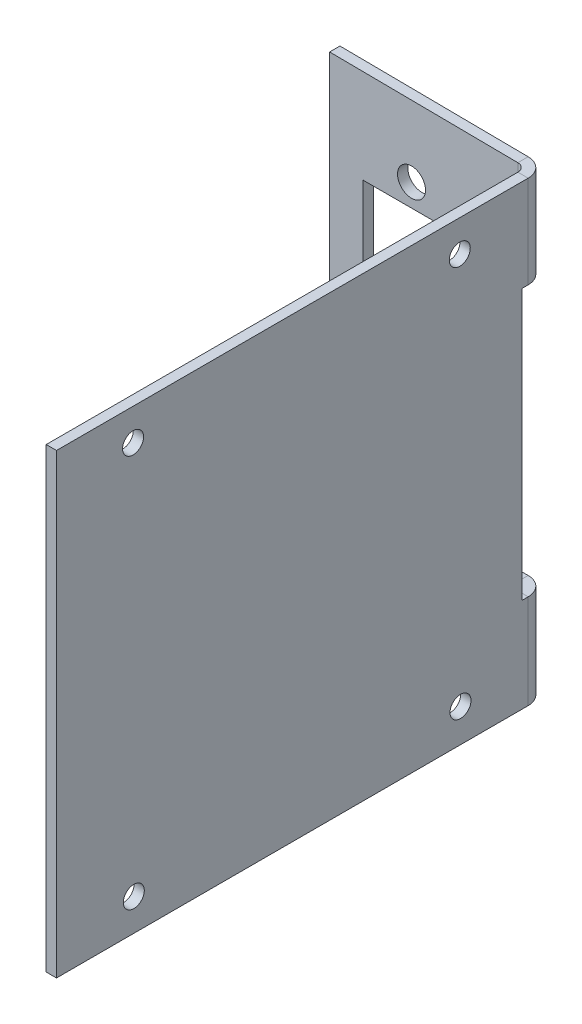
ISO-10303-21;
HEADER;
FILE_DESCRIPTION(('STEP AP214'),'2;1');
FILE_NAME('part.step','',(''),(''),'','','');
FILE_SCHEMA(('AUTOMOTIVE_DESIGN { 1 0 10303 214 1 1 1 1 }'));
ENDSEC;
DATA;
#1=APPLICATION_CONTEXT('core data for automotive mechanical design processes');
#2=APPLICATION_PROTOCOL_DEFINITION('international standard','automotive_design',2000,#1);
#3=PRODUCT_CONTEXT('',#1,'mechanical');
#4=PRODUCT('Part','Part','',(#3));
#5=PRODUCT_RELATED_PRODUCT_CATEGORY('part','',(#4));
#6=PRODUCT_DEFINITION_FORMATION('','',#4);
#7=PRODUCT_DEFINITION_CONTEXT('part definition',#1,'design');
#8=PRODUCT_DEFINITION('design','',#6,#7);
#9=PRODUCT_DEFINITION_SHAPE('','',#8);
#10=(LENGTH_UNIT() NAMED_UNIT(*) SI_UNIT(.MILLI.,.METRE.));
#11=(NAMED_UNIT(*) PLANE_ANGLE_UNIT() SI_UNIT($,.RADIAN.));
#12=(NAMED_UNIT(*) SI_UNIT($,.STERADIAN.) SOLID_ANGLE_UNIT());
#13=UNCERTAINTY_MEASURE_WITH_UNIT(LENGTH_MEASURE(1.E-05),#10,'distance_accuracy_value','');
#14=(GEOMETRIC_REPRESENTATION_CONTEXT(3) GLOBAL_UNCERTAINTY_ASSIGNED_CONTEXT((#13)) GLOBAL_UNIT_ASSIGNED_CONTEXT((#10,
#11,#12)) REPRESENTATION_CONTEXT('',''));
#15=CARTESIAN_POINT('',(0.,0.,0.));
#16=DIRECTION('',(0.,0.,1.));
#17=DIRECTION('',(1.,0.,0.));
#18=AXIS2_PLACEMENT_3D('',#15,#16,#17);
#19=CARTESIAN_POINT('',(-22.7799950955214,0.,1.5875));
#20=DIRECTION('',(-1.,0.,0.));
#21=DIRECTION('',(0.,-1.,0.));
#22=AXIS2_PLACEMENT_3D('',#19,#20,#21);
#23=PLANE('',#22);
#24=DIRECTION('',(0.,0.,1.));
#25=VECTOR('',#24,1.);
#26=CARTESIAN_POINT('',(-22.7799950955214,2.25093970740309E-08,1.5875));
#27=LINE('',#26,#25);
#28=CARTESIAN_POINT('',(-22.7799950955214,2.25093970740309E-08,-0.0127));
#29=VERTEX_POINT('',#28);
#30=CARTESIAN_POINT('',(-22.7799950955214,2.25093970740309E-08,1.5875));
#31=VERTEX_POINT('',#30);
#32=EDGE_CURVE('E11',#29,#31,#27,.T.);
#33=ORIENTED_EDGE('',*,*,#32,.F.);
#34=DIRECTION('',(0.,1.,0.));
#35=VECTOR('',#34,1.);
#36=CARTESIAN_POINT('',(-22.7799950955214,0.,-0.0127));
#37=LINE('',#36,#35);
#38=CARTESIAN_POINT('',(-22.7799950955214,42.0000000225094,-0.0127));
#39=VERTEX_POINT('',#38);
#40=EDGE_CURVE('E140',#39,#29,#37,.F.);
#41=ORIENTED_EDGE('',*,*,#40,.F.);
#42=DIRECTION('',(0.,0.,1.));
#43=VECTOR('',#42,1.);
#44=CARTESIAN_POINT('',(-22.7799950955214,42.0000000225094,1.5875));
#45=LINE('',#44,#43);
#46=CARTESIAN_POINT('',(-22.7799950955214,42.0000000225094,1.5875));
#47=VERTEX_POINT('',#46);
#48=EDGE_CURVE('E48',#39,#47,#45,.T.);
#49=ORIENTED_EDGE('',*,*,#48,.T.);
#50=DIRECTION('',(0.,-1.,0.));
#51=VECTOR('',#50,1.);
#52=CARTESIAN_POINT('',(-22.7799950955214,0.,1.5875));
#53=LINE('',#52,#51);
#54=EDGE_CURVE('E257',#47,#31,#53,.T.);
#55=ORIENTED_EDGE('',*,*,#54,.T.);
#56=EDGE_LOOP('',(#33,#41,#49,#55));
#57=FACE_BOUND('',#56,.T.);
#58=ADVANCED_FACE('F38',(#57),#23,.F.);
#59=CARTESIAN_POINT('',(0.,42.0000000225094,1.5875));
#60=DIRECTION('',(0.,-1.,0.));
#61=DIRECTION('',(1.,0.,0.));
#62=AXIS2_PLACEMENT_3D('',#59,#60,#61);
#63=PLANE('',#62);
#64=ORIENTED_EDGE('',*,*,#48,.F.);
#65=DIRECTION('',(1.,0.,0.));
#66=VECTOR('',#65,1.);
#67=CARTESIAN_POINT('',(0.,42.0000000225094,-0.0127));
#68=LINE('',#67,#66);
#69=CARTESIAN_POINT('',(1.28483041066385,42.0000000225094,-0.0127));
#70=VERTEX_POINT('',#69);
#71=EDGE_CURVE('E171',#39,#70,#68,.T.);
#72=ORIENTED_EDGE('',*,*,#71,.T.);
#73=DIRECTION('',(0.,0.,1.));
#74=VECTOR('',#73,1.);
#75=CARTESIAN_POINT('',(1.28483041066385,42.0000000225094,1.5875));
#76=LINE('',#75,#74);
#77=CARTESIAN_POINT('',(1.28483041066385,42.0000000225094,1.5875));
#78=VERTEX_POINT('',#77);
#79=EDGE_CURVE('E234',#70,#78,#76,.T.);
#80=ORIENTED_EDGE('',*,*,#79,.T.);
#81=DIRECTION('',(1.,0.,0.));
#82=VECTOR('',#81,1.);
#83=CARTESIAN_POINT('',(0.,42.0000000225094,1.5875));
#84=LINE('',#83,#82);
#85=EDGE_CURVE('E242',#47,#78,#84,.T.);
#86=ORIENTED_EDGE('',*,*,#85,.F.);
#87=EDGE_LOOP('',(#64,#72,#80,#86));
#88=FACE_BOUND('',#87,.T.);
#89=ADVANCED_FACE('F241',(#88),#63,.T.);
#90=CARTESIAN_POINT('',(1.28483041066385,42.0000000225094,2.8575));
#91=DIRECTION('',(0.,-1.,0.));
#92=DIRECTION('',(0.,0.,-1.));
#93=AXIS2_PLACEMENT_3D('',#90,#91,#92);
#94=PLANE('',#93);
#95=ORIENTED_EDGE('',*,*,#79,.F.);
#96=CARTESIAN_POINT('',(1.28483041066385,42.0000000225094,2.8575));
#97=DIRECTION('',(0.,-1.,0.));
#98=DIRECTION('',(1.,0.,0.));
#99=AXIS2_PLACEMENT_3D('',#96,#97,#98);
#100=CIRCLE('',#99,2.8702);
#101=CARTESIAN_POINT('',(4.15503041066385,42.0000000225094,2.85750000000003));
#102=VERTEX_POINT('',#101);
#103=EDGE_CURVE('E167',#102,#70,#100,.F.);
#104=ORIENTED_EDGE('',*,*,#103,.F.);
#105=DIRECTION('',(-1.,0.,0.));
#106=VECTOR('',#105,1.);
#107=CARTESIAN_POINT('',(2.55483041066385,42.0000000225094,2.8575));
#108=LINE('',#107,#106);
#109=CARTESIAN_POINT('',(2.55483041066385,42.0000000225094,2.8575));
#110=VERTEX_POINT('',#109);
#111=EDGE_CURVE('E231',#102,#110,#108,.T.);
#112=ORIENTED_EDGE('',*,*,#111,.T.);
#113=CARTESIAN_POINT('',(1.28483041066385,42.0000000225094,2.8575));
#114=DIRECTION('',(0.,1.,0.));
#115=DIRECTION('',(0.,0.,1.));
#116=AXIS2_PLACEMENT_3D('',#113,#114,#115);
#117=CIRCLE('',#116,1.27);
#118=EDGE_CURVE('E261',#110,#78,#117,.T.);
#119=ORIENTED_EDGE('',*,*,#118,.T.);
#120=EDGE_LOOP('',(#95,#104,#112,#119));
#121=FACE_BOUND('',#120,.T.);
#122=ADVANCED_FACE('F262',(#121),#94,.T.);
#123=CARTESIAN_POINT('',(2.55483041066385,42.0000000225094,3.81));
#124=DIRECTION('',(0.,1.,0.));
#125=DIRECTION('',(0.,0.,-1.));
#126=AXIS2_PLACEMENT_3D('',#123,#124,#125);
#127=PLANE('',#126);
#128=ORIENTED_EDGE('',*,*,#111,.F.);
#129=DIRECTION('',(0.,0.,1.));
#130=VECTOR('',#129,1.);
#131=CARTESIAN_POINT('',(4.15503041066385,42.0000000225094,76.2));
#132=LINE('',#131,#130);
#133=CARTESIAN_POINT('',(4.15503041066385,42.0000000225094,3.81000000000002));
#134=VERTEX_POINT('',#133);
#135=EDGE_CURVE('E163',#134,#102,#132,.F.);
#136=ORIENTED_EDGE('',*,*,#135,.F.);
#137=DIRECTION('',(-1.,0.,0.));
#138=VECTOR('',#137,1.);
#139=CARTESIAN_POINT('',(2.55483041066385,42.0000000225094,3.81));
#140=LINE('',#139,#138);
#141=CARTESIAN_POINT('',(2.55483041066385,42.0000000225094,3.81));
#142=VERTEX_POINT('',#141);
#143=EDGE_CURVE('E228',#134,#142,#140,.T.);
#144=ORIENTED_EDGE('',*,*,#143,.T.);
#145=DIRECTION('',(0.,0.,-1.));
#146=VECTOR('',#145,1.);
#147=CARTESIAN_POINT('',(2.55483041066385,42.0000000225094,3.81));
#148=LINE('',#147,#146);
#149=EDGE_CURVE('E374',#142,#110,#148,.T.);
#150=ORIENTED_EDGE('',*,*,#149,.T.);
#151=EDGE_LOOP('',(#128,#136,#144,#150));
#152=FACE_BOUND('',#151,.T.);
#153=ADVANCED_FACE('F503',(#152),#127,.F.);
#154=CARTESIAN_POINT('',(2.55483041066384,2.25093971240042E-08,3.81));
#155=DIRECTION('',(0.,0.,1.));
#156=DIRECTION('',(0.,1.,0.));
#157=AXIS2_PLACEMENT_3D('',#154,#155,#156);
#158=PLANE('',#157);
#159=ORIENTED_EDGE('',*,*,#143,.F.);
#160=DIRECTION('',(0.,-1.,0.));
#161=VECTOR('',#160,1.);
#162=CARTESIAN_POINT('',(4.15503041066385,56.3748630075559,3.81000000000002));
#163=LINE('',#162,#161);
#164=CARTESIAN_POINT('',(4.15503041066384,2.25093971240042E-08,3.81000000000002));
#165=VERTEX_POINT('',#164);
#166=EDGE_CURVE('E160',#165,#134,#163,.F.);
#167=ORIENTED_EDGE('',*,*,#166,.F.);
#168=DIRECTION('',(-1.,0.,0.));
#169=VECTOR('',#168,1.);
#170=CARTESIAN_POINT('',(2.55483041066384,2.25093971240042E-08,3.81));
#171=LINE('',#170,#169);
#172=CARTESIAN_POINT('',(2.55483041066384,2.25093971240042E-08,3.81));
#173=VERTEX_POINT('',#172);
#174=EDGE_CURVE('E225',#165,#173,#171,.T.);
#175=ORIENTED_EDGE('',*,*,#174,.T.);
#176=DIRECTION('',(0.,1.,0.));
#177=VECTOR('',#176,1.);
#178=CARTESIAN_POINT('',(2.55483041066384,2.25093971240042E-08,3.81));
#179=LINE('',#178,#177);
#180=EDGE_CURVE('E376',#173,#142,#179,.T.);
#181=ORIENTED_EDGE('',*,*,#180,.T.);
#182=EDGE_LOOP('',(#159,#167,#175,#181));
#183=FACE_BOUND('',#182,.T.);
#184=ADVANCED_FACE('F501',(#183),#158,.F.);
#185=CARTESIAN_POINT('',(2.55483041066384,2.25093971240042E-08,3.81));
#186=DIRECTION('',(0.,1.,0.));
#187=DIRECTION('',(0.,0.,-1.));
#188=AXIS2_PLACEMENT_3D('',#185,#186,#187);
#189=PLANE('',#188);
#190=ORIENTED_EDGE('',*,*,#174,.F.);
#191=DIRECTION('',(0.,0.,1.));
#192=VECTOR('',#191,1.);
#193=CARTESIAN_POINT('',(4.15503041066384,2.25093971240042E-08,76.2));
#194=LINE('',#193,#192);
#195=CARTESIAN_POINT('',(4.15503041066384,2.25093971240042E-08,2.85750000000003));
#196=VERTEX_POINT('',#195);
#197=EDGE_CURVE('E156',#165,#196,#194,.F.);
#198=ORIENTED_EDGE('',*,*,#197,.T.);
#199=DIRECTION('',(-1.,0.,0.));
#200=VECTOR('',#199,1.);
#201=CARTESIAN_POINT('',(2.55483041066384,2.25093971240042E-08,2.8575));
#202=LINE('',#201,#200);
#203=CARTESIAN_POINT('',(2.55483041066384,2.25093971240042E-08,2.8575));
#204=VERTEX_POINT('',#203);
#205=EDGE_CURVE('E120',#196,#204,#202,.T.);
#206=ORIENTED_EDGE('',*,*,#205,.T.);
#207=DIRECTION('',(0.,0.,-1.));
#208=VECTOR('',#207,1.);
#209=CARTESIAN_POINT('',(2.55483041066384,2.25093971240042E-08,3.81));
#210=LINE('',#209,#208);
#211=EDGE_CURVE('E381',#173,#204,#210,.T.);
#212=ORIENTED_EDGE('',*,*,#211,.F.);
#213=EDGE_LOOP('',(#190,#198,#206,#212));
#214=FACE_BOUND('',#213,.T.);
#215=ADVANCED_FACE('F497',(#214),#189,.T.);
#216=CARTESIAN_POINT('',(1.28483041066384,2.25094000211862E-08,2.8575));
#217=DIRECTION('',(0.,-1.,0.));
#218=DIRECTION('',(1.,0.,0.));
#219=AXIS2_PLACEMENT_3D('',#216,#217,#218);
#220=PLANE('',#219);
#221=ORIENTED_EDGE('',*,*,#205,.F.);
#222=CARTESIAN_POINT('',(1.28483041066384,2.25094000211862E-08,2.8575));
#223=DIRECTION('',(0.,-1.,0.));
#224=DIRECTION('',(1.,0.,0.));
#225=AXIS2_PLACEMENT_3D('',#222,#223,#224);
#226=CIRCLE('',#225,2.8702);
#227=CARTESIAN_POINT('',(1.28483041066384,2.25094000211862E-08,-0.0127));
#228=VERTEX_POINT('',#227);
#229=EDGE_CURVE('E129',#228,#196,#226,.T.);
#230=ORIENTED_EDGE('',*,*,#229,.F.);
#231=DIRECTION('',(0.,0.,1.));
#232=VECTOR('',#231,1.);
#233=CARTESIAN_POINT('',(1.28483041066384,2.25094000211862E-08,1.5875));
#234=LINE('',#233,#232);
#235=CARTESIAN_POINT('',(1.28483041066384,2.25094000211862E-08,1.5875));
#236=VERTEX_POINT('',#235);
#237=EDGE_CURVE('E42',#228,#236,#234,.T.);
#238=ORIENTED_EDGE('',*,*,#237,.T.);
#239=CARTESIAN_POINT('',(1.28483041066384,2.25094000211862E-08,2.8575));
#240=DIRECTION('',(0.,1.,0.));
#241=DIRECTION('',(-1.,0.,0.));
#242=AXIS2_PLACEMENT_3D('',#239,#240,#241);
#243=CIRCLE('',#242,1.27);
#244=EDGE_CURVE('E223',#236,#204,#243,.F.);
#245=ORIENTED_EDGE('',*,*,#244,.T.);
#246=EDGE_LOOP('',(#221,#230,#238,#245));
#247=FACE_BOUND('',#246,.T.);
#248=ADVANCED_FACE('F142',(#247),#220,.F.);
#249=CARTESIAN_POINT('',(2.55483041066385,56.3748630075559,76.2));
#250=DIRECTION('',(0.,0.,1.));
#251=DIRECTION('',(0.,1.,0.));
#252=AXIS2_PLACEMENT_3D('',#249,#250,#251);
#253=PLANE('',#252);
#254=DIRECTION('',(-1.,0.,0.));
#255=VECTOR('',#254,1.);
#256=CARTESIAN_POINT('',(2.55483041066384,-14.6647486988781,76.2));
#257=LINE('',#256,#255);
#258=CARTESIAN_POINT('',(4.15503041066384,-14.6647486988781,76.2));
#259=VERTEX_POINT('',#258);
#260=CARTESIAN_POINT('',(2.55483041066384,-14.6647486988781,76.2));
#261=VERTEX_POINT('',#260);
#262=EDGE_CURVE('E121',#259,#261,#257,.T.);
#263=ORIENTED_EDGE('',*,*,#262,.F.);
#264=DIRECTION('',(0.,-1.,0.));
#265=VECTOR('',#264,1.);
#266=CARTESIAN_POINT('',(4.15503041066385,56.3748630075559,76.2));
#267=LINE('',#266,#265);
#268=CARTESIAN_POINT('',(4.15503041066385,56.3748630075559,76.2));
#269=VERTEX_POINT('',#268);
#270=EDGE_CURVE('E192',#259,#269,#267,.F.);
#271=ORIENTED_EDGE('',*,*,#270,.T.);
#272=DIRECTION('',(-1.,0.,0.));
#273=VECTOR('',#272,1.);
#274=CARTESIAN_POINT('',(2.55483041066385,56.3748630075559,76.2));
#275=LINE('',#274,#273);
#276=CARTESIAN_POINT('',(2.55483041066385,56.3748630075559,76.2));
#277=VERTEX_POINT('',#276);
#278=EDGE_CURVE('E216',#269,#277,#275,.T.);
#279=ORIENTED_EDGE('',*,*,#278,.T.);
#280=DIRECTION('',(0.,1.,0.));
#281=VECTOR('',#280,1.);
#282=CARTESIAN_POINT('',(2.55483041066385,56.3748630075559,76.2));
#283=LINE('',#282,#281);
#284=EDGE_CURVE('E372',#261,#277,#283,.T.);
#285=ORIENTED_EDGE('',*,*,#284,.F.);
#286=EDGE_LOOP('',(#263,#271,#279,#285));
#287=FACE_BOUND('',#286,.T.);
#288=ADVANCED_FACE('F524',(#287),#253,.T.);
#289=CARTESIAN_POINT('',(2.55483041066385,56.3748630075559,76.2));
#290=DIRECTION('',(0.,1.,0.));
#291=DIRECTION('',(0.,0.,-1.));
#292=AXIS2_PLACEMENT_3D('',#289,#290,#291);
#293=PLANE('',#292);
#294=ORIENTED_EDGE('',*,*,#278,.F.);
#295=DIRECTION('',(0.,0.,1.));
#296=VECTOR('',#295,1.);
#297=CARTESIAN_POINT('',(4.15503041066385,56.3748630075559,76.2));
#298=LINE('',#297,#296);
#299=CARTESIAN_POINT('',(4.15503041066385,56.3748630075559,2.85750000000005));
#300=VERTEX_POINT('',#299);
#301=EDGE_CURVE('E302',#269,#300,#298,.F.);
#302=ORIENTED_EDGE('',*,*,#301,.T.);
#303=DIRECTION('',(-1.,0.,0.));
#304=VECTOR('',#303,1.);
#305=CARTESIAN_POINT('',(2.55483041066385,56.3748630075559,2.85750000000003));
#306=LINE('',#305,#304);
#307=CARTESIAN_POINT('',(2.55483041066385,56.3748630075559,2.85750000000003));
#308=VERTEX_POINT('',#307);
#309=EDGE_CURVE('E213',#300,#308,#306,.T.);
#310=ORIENTED_EDGE('',*,*,#309,.T.);
#311=DIRECTION('',(0.,0.,-1.));
#312=VECTOR('',#311,1.);
#313=CARTESIAN_POINT('',(2.55483041066385,56.3748630075559,76.2));
#314=LINE('',#313,#312);
#315=EDGE_CURVE('E145',#277,#308,#314,.T.);
#316=ORIENTED_EDGE('',*,*,#315,.F.);
#317=EDGE_LOOP('',(#294,#302,#310,#316));
#318=FACE_BOUND('',#317,.T.);
#319=ADVANCED_FACE('F360',(#318),#293,.T.);
#320=CARTESIAN_POINT('',(4.15503041066385,56.3748630075559,2.8575));
#321=CARTESIAN_POINT('',(3.62163041066385,56.3748630075559,2.8575));
#322=CARTESIAN_POINT('',(3.08823041066385,56.3748630075559,2.8575));
#323=CARTESIAN_POINT('',(2.55483041066385,56.3748630075559,2.8575));
#324=CARTESIAN_POINT('',(4.15503041066385,56.3748630075559,8.5979));
#325=CARTESIAN_POINT('',(3.62163041066385,56.3748630075559,7.5311));
#326=CARTESIAN_POINT('',(3.08823041066385,56.3748630075559,6.4643));
#327=CARTESIAN_POINT('',(2.55483041066385,56.3748630075559,5.3975));
#328=CARTESIAN_POINT('',(-1.58536958933615,56.3990843667302,8.5979));
#329=CARTESIAN_POINT('',(-1.05196958933615,56.3990843667302,7.5311));
#330=CARTESIAN_POINT('',(-0.518569589336152,56.3990843667302,6.4643));
#331=CARTESIAN_POINT('',(0.0148304106638476,56.3990843667302,5.3975));
#332=CARTESIAN_POINT('',(-1.58536958933615,56.3990843667301,2.8575));
#333=CARTESIAN_POINT('',(-1.05196958933615,56.3990843667301,2.8575));
#334=CARTESIAN_POINT('',(-0.518569589336152,56.3990843667301,2.8575));
#335=CARTESIAN_POINT('',(0.0148304106638479,56.3990843667301,2.8575));
#336=CARTESIAN_POINT('',(-1.58536958933615,56.3990843667302,-2.8829));
#337=CARTESIAN_POINT('',(-1.05196958933615,56.3990843667302,-1.8161));
#338=CARTESIAN_POINT('',(-0.518569589336152,56.3990843667302,-0.7493));
#339=CARTESIAN_POINT('',(0.0148304106638483,56.3990843667302,0.3175));
#340=CARTESIAN_POINT('',(4.15503041066385,56.3748630075559,-2.8829));
#341=CARTESIAN_POINT('',(3.62163041066385,56.3748630075559,-1.8161));
#342=CARTESIAN_POINT('',(3.08823041066385,56.3748630075559,-0.7493));
#343=CARTESIAN_POINT('',(2.55483041066385,56.3748630075559,0.3175));
#344=CARTESIAN_POINT('',(4.15503041066385,56.3748630075559,2.8575));
#345=CARTESIAN_POINT('',(3.62163041066385,56.3748630075559,2.8575));
#346=CARTESIAN_POINT('',(3.08823041066385,56.3748630075559,2.8575));
#347=CARTESIAN_POINT('',(2.55483041066385,56.3748630075559,2.8575));
#348=(BOUNDED_SURFACE() B_SPLINE_SURFACE(3,3,((#320,#321,#322,#323),(#324,#325,#326,#327),(#328,
#329,#330,#331),(#332,#333,#334,#335),(#336,#337,#338,#339),(#340,#341,#342,#343),(#344,#345,
#346,#347)),.UNSPECIFIED.,.T.,.F.,.F.) B_SPLINE_SURFACE_WITH_KNOTS((4,3,4),(4,4),(0.,0.5,1.),
(0.,1.),.UNSPECIFIED.) GEOMETRIC_REPRESENTATION_ITEM() RATIONAL_B_SPLINE_SURFACE(((1.,1.,1.,1.),
(0.333333333333333,0.333333333333333,0.333333333333333,0.333333333333333),(0.333333333333333,
0.333333333333333,0.333333333333333,0.333333333333333),(1.,1.,1.,1.),(0.333333333333333,
0.333333333333333,0.333333333333333,0.333333333333333),(0.333333333333333,0.333333333333333,
0.333333333333333,0.333333333333333),(1.,1.,1.,1.))) REPRESENTATION_ITEM('') SURFACE());
#349=CARTESIAN_POINT('',(1.28483041066385,56.386973687143,2.8575));
#350=DIRECTION('',(0.00421941738571467,0.999991098218842,0.));
#351=DIRECTION('',(0.999991098218842,-0.00421941738571467,0.));
#352=AXIS2_PLACEMENT_3D('',#349,#350,#351);
#353=ELLIPSE('',#352,2.87022555011972,2.8702);
#354=CARTESIAN_POINT('',(1.28483041066385,56.386973687143,-0.0127));
#355=VERTEX_POINT('',#354);
#356=EDGE_CURVE('E150',#355,#300,#353,.F.);
#357=DIRECTION('',(0.,0.,1.));
#358=VECTOR('',#357,1.);
#359=CARTESIAN_POINT('',(1.28483041066385,56.386973687143,1.5875));
#360=LINE('',#359,#358);
#361=CARTESIAN_POINT('',(1.28483041066385,56.386973687143,1.5875));
#362=VERTEX_POINT('',#361);
#363=EDGE_CURVE('E210',#355,#362,#360,.T.);
#364=CARTESIAN_POINT('',(1.28483041066385,56.386973687143,2.8575));
#365=DIRECTION('',(0.00953553463323446,0.99995453575613,0.));
#366=DIRECTION('',(0.99995453575613,-0.00953553463323446,0.));
#367=AXIS2_PLACEMENT_3D('',#364,#365,#366);
#368=ELLIPSE('',#367,1.27005774221492,1.27);
#369=EDGE_CURVE('E267',#362,#308,#368,.F.);
#370=ORIENTED_EDGE('',*,*,#309,.F.);
#371=ORIENTED_EDGE('',*,*,#356,.F.);
#372=ORIENTED_EDGE('',*,*,#363,.T.);
#373=ORIENTED_EDGE('',*,*,#369,.T.);
#374=EDGE_LOOP('',(#370,#371,#372,#373));
#375=FACE_BOUND('',#374,.T.);
#376=ADVANCED_FACE('F373',(#375),#348,.F.);
#377=CARTESIAN_POINT('',(0.537772320275598,56.3940976093207,1.5875));
#378=DIRECTION('',(-0.00953553463323446,-0.999954535756131,0.));
#379=DIRECTION('',(0.999954535756131,-0.00953553463323446,0.));
#380=AXIS2_PLACEMENT_3D('',#377,#378,#379);
#381=PLANE('',#380);
#382=ORIENTED_EDGE('',*,*,#363,.F.);
#383=DIRECTION('',(0.999954535756131,-0.00953553463323446,0.));
#384=VECTOR('',#383,1.);
#385=CARTESIAN_POINT('',(0.537772320275598,56.3940976093207,-0.0127));
#386=LINE('',#385,#384);
#387=CARTESIAN_POINT('',(-27.9825823424288,56.6660668038328,-0.0127));
#388=VERTEX_POINT('',#387);
#389=EDGE_CURVE('E300',#388,#355,#386,.T.);
#390=ORIENTED_EDGE('',*,*,#389,.F.);
#391=DIRECTION('',(0.,0.,1.));
#392=VECTOR('',#391,1.);
#393=CARTESIAN_POINT('',(-27.9825823424288,56.6660668038328,1.5875));
#394=LINE('',#393,#392);
#395=CARTESIAN_POINT('',(-27.9825823424288,56.6660668038328,1.5875));
#396=VERTEX_POINT('',#395);
#397=EDGE_CURVE('E207',#388,#396,#394,.T.);
#398=ORIENTED_EDGE('',*,*,#397,.T.);
#399=DIRECTION('',(0.999954535756131,-0.00953553463323446,0.));
#400=VECTOR('',#399,1.);
#401=CARTESIAN_POINT('',(0.537772320275598,56.3940976093207,1.5875));
#402=LINE('',#401,#400);
#403=EDGE_CURVE('E274',#396,#362,#402,.T.);
#404=ORIENTED_EDGE('',*,*,#403,.T.);
#405=EDGE_LOOP('',(#382,#390,#398,#404));
#406=FACE_BOUND('',#405,.T.);
#407=ADVANCED_FACE('F504',(#406),#381,.F.);
#408=CARTESIAN_POINT('',(-27.9825823424288,0.,1.5875));
#409=DIRECTION('',(1.,0.,0.));
#410=DIRECTION('',(0.,1.,0.));
#411=AXIS2_PLACEMENT_3D('',#408,#409,#410);
#412=PLANE('',#411);
#413=ORIENTED_EDGE('',*,*,#397,.F.);
#414=DIRECTION('',(0.,1.,0.));
#415=VECTOR('',#414,1.);
#416=CARTESIAN_POINT('',(-27.9825823424288,0.,-0.0127));
#417=LINE('',#416,#415);
#418=CARTESIAN_POINT('',(-27.9825823424288,-14.6647486988781,-0.0127));
#419=VERTEX_POINT('',#418);
#420=EDGE_CURVE('E305',#419,#388,#417,.T.);
#421=ORIENTED_EDGE('',*,*,#420,.F.);
#422=DIRECTION('',(0.,0.,1.));
#423=VECTOR('',#422,1.);
#424=CARTESIAN_POINT('',(-27.9825823424288,-14.6647486988781,1.5875));
#425=LINE('',#424,#423);
#426=CARTESIAN_POINT('',(-27.9825823424288,-14.6647486988781,1.5875));
#427=VERTEX_POINT('',#426);
#428=EDGE_CURVE('E203',#419,#427,#425,.T.);
#429=ORIENTED_EDGE('',*,*,#428,.T.);
#430=DIRECTION('',(0.,1.,0.));
#431=VECTOR('',#430,1.);
#432=CARTESIAN_POINT('',(-27.9825823424288,0.,1.5875));
#433=LINE('',#432,#431);
#434=EDGE_CURVE('E276',#427,#396,#433,.T.);
#435=ORIENTED_EDGE('',*,*,#434,.T.);
#436=EDGE_LOOP('',(#413,#421,#429,#435));
#437=FACE_BOUND('',#436,.T.);
#438=ADVANCED_FACE('F340',(#437),#412,.F.);
#439=CARTESIAN_POINT('',(0.,-14.6647486988781,1.5875));
#440=DIRECTION('',(0.,-1.,0.));
#441=DIRECTION('',(1.,0.,0.));
#442=AXIS2_PLACEMENT_3D('',#439,#440,#441);
#443=PLANE('',#442);
#444=ORIENTED_EDGE('',*,*,#428,.F.);
#445=DIRECTION('',(1.,0.,0.));
#446=VECTOR('',#445,1.);
#447=CARTESIAN_POINT('',(0.,-14.6647486988781,-0.0127));
#448=LINE('',#447,#446);
#449=CARTESIAN_POINT('',(1.28483041066384,-14.6647486988781,-0.0127));
#450=VERTEX_POINT('',#449);
#451=EDGE_CURVE('E135',#419,#450,#448,.T.);
#452=ORIENTED_EDGE('',*,*,#451,.T.);
#453=DIRECTION('',(0.,0.,1.));
#454=VECTOR('',#453,1.);
#455=CARTESIAN_POINT('',(1.28483041066384,-14.6647486988781,1.5875));
#456=LINE('',#455,#454);
#457=CARTESIAN_POINT('',(1.28483041066384,-14.6647486988781,1.5875));
#458=VERTEX_POINT('',#457);
#459=EDGE_CURVE('E200',#450,#458,#456,.T.);
#460=ORIENTED_EDGE('',*,*,#459,.T.);
#461=DIRECTION('',(1.,0.,0.));
#462=VECTOR('',#461,1.);
#463=CARTESIAN_POINT('',(0.,-14.6647486988781,1.5875));
#464=LINE('',#463,#462);
#465=EDGE_CURVE('E282',#427,#458,#464,.T.);
#466=ORIENTED_EDGE('',*,*,#465,.F.);
#467=EDGE_LOOP('',(#444,#452,#460,#466));
#468=FACE_BOUND('',#467,.T.);
#469=ADVANCED_FACE('F333',(#468),#443,.T.);
#470=CARTESIAN_POINT('',(1.28483041066384,-14.6647486988781,2.8575));
#471=DIRECTION('',(0.,-1.,0.));
#472=DIRECTION('',(1.,0.,0.));
#473=AXIS2_PLACEMENT_3D('',#470,#471,#472);
#474=PLANE('',#473);
#475=ORIENTED_EDGE('',*,*,#459,.F.);
#476=CARTESIAN_POINT('',(1.28483041066384,-14.6647486988781,2.8575));
#477=DIRECTION('',(0.,-1.,0.));
#478=DIRECTION('',(1.,0.,0.));
#479=AXIS2_PLACEMENT_3D('',#476,#477,#478);
#480=CIRCLE('',#479,2.8702);
#481=CARTESIAN_POINT('',(4.15503041066384,-14.6647486988781,2.85750000000005));
#482=VERTEX_POINT('',#481);
#483=EDGE_CURVE('E131',#482,#450,#480,.F.);
#484=ORIENTED_EDGE('',*,*,#483,.F.);
#485=DIRECTION('',(-1.,0.,0.));
#486=VECTOR('',#485,1.);
#487=CARTESIAN_POINT('',(2.55483041066384,-14.6647486988781,2.85750000000003));
#488=LINE('',#487,#486);
#489=CARTESIAN_POINT('',(2.55483041066384,-14.6647486988781,2.85750000000003));
#490=VERTEX_POINT('',#489);
#491=EDGE_CURVE('E204',#482,#490,#488,.T.);
#492=ORIENTED_EDGE('',*,*,#491,.T.);
#493=CARTESIAN_POINT('',(1.28483041066384,-14.6647486988781,2.8575));
#494=DIRECTION('',(0.,1.,0.));
#495=DIRECTION('',(-1.,0.,0.));
#496=AXIS2_PLACEMENT_3D('',#493,#494,#495);
#497=CIRCLE('',#496,1.27);
#498=EDGE_CURVE('E293',#490,#458,#497,.T.);
#499=ORIENTED_EDGE('',*,*,#498,.T.);
#500=EDGE_LOOP('',(#475,#484,#492,#499));
#501=FACE_BOUND('',#500,.T.);
#502=ADVANCED_FACE('F325',(#501),#474,.T.);
#503=CARTESIAN_POINT('',(2.55483041066384,-9.50555666323026,13.3777957054636));
#504=DIRECTION('',(-1.,0.,0.));
#505=DIRECTION('',(0.,-1.,0.));
#506=AXIS2_PLACEMENT_3D('',#503,#504,#505);
#507=CYLINDRICAL_SURFACE('',#506,1.63195);
#508=CARTESIAN_POINT('',(2.55483041066384,-9.50555666323026,13.3777957054636));
#509=DIRECTION('',(-1.,0.,0.));
#510=DIRECTION('',(0.,1.,0.));
#511=AXIS2_PLACEMENT_3D('',#508,#509,#510);
#512=CIRCLE('',#511,1.63195);
#513=CARTESIAN_POINT('',(2.55483041066384,-7.87360666323026,13.3777957054636));
#514=VERTEX_POINT('',#513);
#515=EDGE_CURVE('E390',#514,#514,#512,.T.);
#516=ORIENTED_EDGE('',*,*,#515,.T.);
#517=EDGE_LOOP('',(#516));
#518=FACE_BOUND('',#517,.T.);
#519=CARTESIAN_POINT('',(4.15503041066384,-9.50555666323026,13.3777957054636));
#520=DIRECTION('',(-1.,0.,0.));
#521=DIRECTION('',(0.,-1.,0.));
#522=AXIS2_PLACEMENT_3D('',#519,#520,#521);
#523=CIRCLE('',#522,1.63195);
#524=CARTESIAN_POINT('',(4.15503041066384,-11.1375066632303,13.3777957054636));
#525=VERTEX_POINT('',#524);
#526=EDGE_CURVE('E188',#525,#525,#523,.T.);
#527=ORIENTED_EDGE('',*,*,#526,.F.);
#528=EDGE_LOOP('',(#527));
#529=FACE_BOUND('',#528,.T.);
#530=ADVANCED_FACE('F453',(#518,#529),#507,.F.);
#531=CARTESIAN_POINT('',(2.55483041066384,-9.69881312156454,64.1774281051308));
#532=DIRECTION('',(-1.,0.,0.));
#533=DIRECTION('',(0.,-1.,0.));
#534=AXIS2_PLACEMENT_3D('',#531,#532,#533);
#535=CYLINDRICAL_SURFACE('',#534,1.63195);
#536=CARTESIAN_POINT('',(2.55483041066384,-9.69881312156454,64.1774281051308));
#537=DIRECTION('',(-1.,0.,0.));
#538=DIRECTION('',(0.,-1.,0.));
#539=AXIS2_PLACEMENT_3D('',#536,#537,#538);
#540=CIRCLE('',#539,1.63195);
#541=CARTESIAN_POINT('',(2.55483041066384,-11.3307631215645,64.1774281051308));
#542=VERTEX_POINT('',#541);
#543=EDGE_CURVE('E393',#542,#542,#540,.T.);
#544=ORIENTED_EDGE('',*,*,#543,.T.);
#545=EDGE_LOOP('',(#544));
#546=FACE_BOUND('',#545,.T.);
#547=CARTESIAN_POINT('',(4.15503041066384,-9.69881312156454,64.1774281051308));
#548=DIRECTION('',(-1.,0.,0.));
#549=DIRECTION('',(0.,-1.,0.));
#550=AXIS2_PLACEMENT_3D('',#547,#548,#549);
#551=CIRCLE('',#550,1.63195);
#552=CARTESIAN_POINT('',(4.15503041066384,-11.3307631215645,64.1774281051308));
#553=VERTEX_POINT('',#552);
#554=EDGE_CURVE('E191',#553,#553,#551,.T.);
#555=ORIENTED_EDGE('',*,*,#554,.F.);
#556=EDGE_LOOP('',(#555));
#557=FACE_BOUND('',#556,.T.);
#558=ADVANCED_FACE('F456',(#546,#557),#535,.F.);
#559=CARTESIAN_POINT('',(2.55483041066385,51.4544433367697,64.29375));
#560=DIRECTION('',(-1.,0.,0.));
#561=DIRECTION('',(0.,-1.,0.));
#562=AXIS2_PLACEMENT_3D('',#559,#560,#561);
#563=CYLINDRICAL_SURFACE('',#562,1.63195000000001);
#564=CARTESIAN_POINT('',(2.55483041066385,51.4544433367697,64.29375));
#565=DIRECTION('',(-1.,0.,0.));
#566=DIRECTION('',(0.,1.,0.));
#567=AXIS2_PLACEMENT_3D('',#564,#565,#566);
#568=CIRCLE('',#567,1.63195000000001);
#569=CARTESIAN_POINT('',(2.55483041066385,53.0863933367697,64.29375));
#570=VERTEX_POINT('',#569);
#571=EDGE_CURVE('E396',#570,#570,#568,.T.);
#572=ORIENTED_EDGE('',*,*,#571,.T.);
#573=EDGE_LOOP('',(#572));
#574=FACE_BOUND('',#573,.T.);
#575=CARTESIAN_POINT('',(4.15503041066385,51.4544433367697,64.29375));
#576=DIRECTION('',(-1.,0.,0.));
#577=DIRECTION('',(0.,-1.,0.));
#578=AXIS2_PLACEMENT_3D('',#575,#576,#577);
#579=CIRCLE('',#578,1.63195000000001);
#580=CARTESIAN_POINT('',(4.15503041066385,49.8224933367697,64.29375));
#581=VERTEX_POINT('',#580);
#582=EDGE_CURVE('E195',#581,#581,#579,.T.);
#583=ORIENTED_EDGE('',*,*,#582,.F.);
#584=EDGE_LOOP('',(#583));
#585=FACE_BOUND('',#584,.T.);
#586=ADVANCED_FACE('F459',(#574,#585),#563,.F.);
#587=CARTESIAN_POINT('',(2.55483041066385,51.4544433367697,13.49375));
#588=DIRECTION('',(-1.,0.,0.));
#589=DIRECTION('',(0.,-1.,0.));
#590=AXIS2_PLACEMENT_3D('',#587,#588,#589);
#591=CYLINDRICAL_SURFACE('',#590,1.63195);
#592=CARTESIAN_POINT('',(2.55483041066385,51.4544433367697,13.49375));
#593=DIRECTION('',(-1.,0.,0.));
#594=DIRECTION('',(0.,-1.,0.));
#595=AXIS2_PLACEMENT_3D('',#592,#593,#594);
#596=CIRCLE('',#595,1.63195);
#597=CARTESIAN_POINT('',(2.55483041066385,49.8224933367697,13.49375));
#598=VERTEX_POINT('',#597);
#599=EDGE_CURVE('E399',#598,#598,#596,.T.);
#600=ORIENTED_EDGE('',*,*,#599,.T.);
#601=EDGE_LOOP('',(#600));
#602=FACE_BOUND('',#601,.T.);
#603=CARTESIAN_POINT('',(4.15503041066385,51.4544433367697,13.49375));
#604=DIRECTION('',(-1.,0.,0.));
#605=DIRECTION('',(0.,-1.,0.));
#606=AXIS2_PLACEMENT_3D('',#603,#604,#605);
#607=CIRCLE('',#606,1.63195);
#608=CARTESIAN_POINT('',(4.15503041066385,49.8224933367697,13.49375));
#609=VERTEX_POINT('',#608);
#610=EDGE_CURVE('E181',#609,#609,#607,.T.);
#611=ORIENTED_EDGE('',*,*,#610,.F.);
#612=EDGE_LOOP('',(#611));
#613=FACE_BOUND('',#612,.T.);
#614=ADVANCED_FACE('F40',(#602,#613),#591,.F.);
#615=CARTESIAN_POINT('',(-15.25,-3.5,1.5875));
#616=DIRECTION('',(0.,0.,1.));
#617=DIRECTION('',(1.,0.,0.));
#618=AXIS2_PLACEMENT_3D('',#615,#616,#617);
#619=CYLINDRICAL_SURFACE('',#618,2.17499999999999);
#620=CARTESIAN_POINT('',(-15.25,-3.5,1.5875));
#621=DIRECTION('',(0.,0.,1.));
#622=DIRECTION('',(1.,0.,0.));
#623=AXIS2_PLACEMENT_3D('',#620,#621,#622);
#624=CIRCLE('',#623,2.17499999999999);
#625=CARTESIAN_POINT('',(-13.075,-3.5,1.5875));
#626=VERTEX_POINT('',#625);
#627=EDGE_CURVE('E402',#626,#626,#624,.T.);
#628=ORIENTED_EDGE('',*,*,#627,.T.);
#629=EDGE_LOOP('',(#628));
#630=FACE_BOUND('',#629,.T.);
#631=CARTESIAN_POINT('',(-15.25,-3.5,-0.0127));
#632=DIRECTION('',(0.,0.,1.));
#633=DIRECTION('',(1.,0.,0.));
#634=AXIS2_PLACEMENT_3D('',#631,#632,#633);
#635=CIRCLE('',#634,2.17499999999999);
#636=CARTESIAN_POINT('',(-13.075,-3.5,-0.0127));
#637=VERTEX_POINT('',#636);
#638=EDGE_CURVE('E177',#637,#637,#635,.T.);
#639=ORIENTED_EDGE('',*,*,#638,.F.);
#640=EDGE_LOOP('',(#639));
#641=FACE_BOUND('',#640,.T.);
#642=ADVANCED_FACE('F443',(#630,#641),#619,.F.);
#643=CARTESIAN_POINT('',(-5.25,-3.5,1.5875));
#644=DIRECTION('',(0.,0.,1.));
#645=DIRECTION('',(1.,0.,0.));
#646=AXIS2_PLACEMENT_3D('',#643,#644,#645);
#647=CYLINDRICAL_SURFACE('',#646,2.17499999999999);
#648=CARTESIAN_POINT('',(-5.25,-3.5,1.5875));
#649=DIRECTION('',(0.,0.,1.));
#650=DIRECTION('',(1.,0.,0.));
#651=AXIS2_PLACEMENT_3D('',#648,#649,#650);
#652=CIRCLE('',#651,2.17499999999999);
#653=CARTESIAN_POINT('',(-3.07500000000001,-3.5,1.5875));
#654=VERTEX_POINT('',#653);
#655=EDGE_CURVE('E405',#654,#654,#652,.T.);
#656=ORIENTED_EDGE('',*,*,#655,.T.);
#657=EDGE_LOOP('',(#656));
#658=FACE_BOUND('',#657,.T.);
#659=CARTESIAN_POINT('',(-5.25,-3.5,-0.0127));
#660=DIRECTION('',(0.,0.,1.));
#661=DIRECTION('',(1.,0.,0.));
#662=AXIS2_PLACEMENT_3D('',#659,#660,#661);
#663=CIRCLE('',#662,2.17499999999999);
#664=CARTESIAN_POINT('',(-3.07500000000001,-3.5,-0.0127));
#665=VERTEX_POINT('',#664);
#666=EDGE_CURVE('E180',#665,#665,#663,.T.);
#667=ORIENTED_EDGE('',*,*,#666,.F.);
#668=EDGE_LOOP('',(#667));
#669=FACE_BOUND('',#668,.T.);
#670=ADVANCED_FACE('F415',(#658,#669),#647,.F.);
#671=CARTESIAN_POINT('',(-15.25,45.5000000450188,1.5875));
#672=DIRECTION('',(0.,0.,1.));
#673=DIRECTION('',(1.,0.,0.));
#674=AXIS2_PLACEMENT_3D('',#671,#672,#673);
#675=CYLINDRICAL_SURFACE('',#674,2.175);
#676=CARTESIAN_POINT('',(-15.25,45.5000000450188,1.5875));
#677=DIRECTION('',(0.,0.,1.));
#678=DIRECTION('',(1.,0.,0.));
#679=AXIS2_PLACEMENT_3D('',#676,#677,#678);
#680=CIRCLE('',#679,2.175);
#681=CARTESIAN_POINT('',(-13.075,45.5000000450188,1.5875));
#682=VERTEX_POINT('',#681);
#683=EDGE_CURVE('E258',#682,#682,#680,.F.);
#684=ORIENTED_EDGE('',*,*,#683,.F.);
#685=EDGE_LOOP('',(#684));
#686=FACE_BOUND('',#685,.T.);
#687=CARTESIAN_POINT('',(-15.25,45.5000000450188,-0.0127));
#688=DIRECTION('',(0.,0.,1.));
#689=DIRECTION('',(1.,0.,0.));
#690=AXIS2_PLACEMENT_3D('',#687,#688,#689);
#691=CIRCLE('',#690,2.175);
#692=CARTESIAN_POINT('',(-13.075,45.5000000450188,-0.0127));
#693=VERTEX_POINT('',#692);
#694=EDGE_CURVE('E175',#693,#693,#691,.F.);
#695=ORIENTED_EDGE('',*,*,#694,.T.);
#696=EDGE_LOOP('',(#695));
#697=FACE_BOUND('',#696,.T.);
#698=ADVANCED_FACE('F411',(#686,#697),#675,.F.);
#699=CARTESIAN_POINT('',(-5.25,45.5000000450188,1.5875));
#700=DIRECTION('',(0.,0.,1.));
#701=DIRECTION('',(1.,0.,0.));
#702=AXIS2_PLACEMENT_3D('',#699,#700,#701);
#703=CYLINDRICAL_SURFACE('',#702,2.17499999999999);
#704=CARTESIAN_POINT('',(-5.25,45.5000000450188,1.5875));
#705=DIRECTION('',(0.,0.,1.));
#706=DIRECTION('',(1.,0.,0.));
#707=AXIS2_PLACEMENT_3D('',#704,#705,#706);
#708=CIRCLE('',#707,2.17499999999999);
#709=CARTESIAN_POINT('',(-3.075,45.5000000450188,1.5875));
#710=VERTEX_POINT('',#709);
#711=EDGE_CURVE('E268',#710,#710,#708,.F.);
#712=ORIENTED_EDGE('',*,*,#711,.F.);
#713=EDGE_LOOP('',(#712));
#714=FACE_BOUND('',#713,.T.);
#715=CARTESIAN_POINT('',(-5.25,45.5000000450188,-0.0127));
#716=DIRECTION('',(0.,0.,1.));
#717=DIRECTION('',(1.,0.,0.));
#718=AXIS2_PLACEMENT_3D('',#715,#716,#717);
#719=CIRCLE('',#718,2.17499999999999);
#720=CARTESIAN_POINT('',(-3.075,45.5000000450188,-0.0127));
#721=VERTEX_POINT('',#720);
#722=EDGE_CURVE('E170',#721,#721,#719,.F.);
#723=ORIENTED_EDGE('',*,*,#722,.T.);
#724=EDGE_LOOP('',(#723));
#725=FACE_BOUND('',#724,.T.);
#726=ADVANCED_FACE('F414',(#714,#725),#703,.F.);
#727=CARTESIAN_POINT('',(2.55483041066384,-14.6647486988781,76.2));
#728=DIRECTION('',(0.,1.,0.));
#729=DIRECTION('',(0.,0.,-1.));
#730=AXIS2_PLACEMENT_3D('',#727,#728,#729);
#731=PLANE('',#730);
#732=DIRECTION('',(0.,0.,1.));
#733=VECTOR('',#732,1.);
#734=CARTESIAN_POINT('',(4.15503041066384,-14.6647486988781,76.2));
#735=LINE('',#734,#733);
#736=EDGE_CURVE('E154',#259,#482,#735,.F.);
#737=ORIENTED_EDGE('',*,*,#736,.F.);
#738=ORIENTED_EDGE('',*,*,#262,.T.);
#739=DIRECTION('',(0.,0.,-1.));
#740=VECTOR('',#739,1.);
#741=CARTESIAN_POINT('',(2.55483041066384,-14.6647486988781,76.2));
#742=LINE('',#741,#740);
#743=EDGE_CURVE('E387',#261,#490,#742,.T.);
#744=ORIENTED_EDGE('',*,*,#743,.T.);
#745=ORIENTED_EDGE('',*,*,#491,.F.);
#746=EDGE_LOOP('',(#737,#738,#744,#745));
#747=FACE_BOUND('',#746,.T.);
#748=ADVANCED_FACE('F442',(#747),#731,.F.);
#749=CARTESIAN_POINT('',(0.,2.25093998638363E-08,1.5875));
#750=DIRECTION('',(0.,-1.,0.));
#751=DIRECTION('',(1.,0.,0.));
#752=AXIS2_PLACEMENT_3D('',#749,#750,#751);
#753=PLANE('',#752);
#754=DIRECTION('',(1.,0.,0.));
#755=VECTOR('',#754,1.);
#756=CARTESIAN_POINT('',(0.,2.25093970740309E-08,-0.0127));
#757=LINE('',#756,#755);
#758=EDGE_CURVE('E113',#29,#228,#757,.T.);
#759=ORIENTED_EDGE('',*,*,#758,.F.);
#760=ORIENTED_EDGE('',*,*,#32,.T.);
#761=DIRECTION('',(1.,0.,0.));
#762=VECTOR('',#761,1.);
#763=CARTESIAN_POINT('',(0.,2.25093998638363E-08,1.5875));
#764=LINE('',#763,#762);
#765=EDGE_CURVE('E115',#31,#236,#764,.T.);
#766=ORIENTED_EDGE('',*,*,#765,.T.);
#767=ORIENTED_EDGE('',*,*,#237,.F.);
#768=EDGE_LOOP('',(#759,#760,#766,#767));
#769=FACE_BOUND('',#768,.T.);
#770=ADVANCED_FACE('F111',(#769),#753,.F.);
#771=CARTESIAN_POINT('',(1.28483041066384,0.,2.8575));
#772=DIRECTION('',(0.,-1.,0.));
#773=DIRECTION('',(1.,0.,0.));
#774=AXIS2_PLACEMENT_3D('',#771,#772,#773);
#775=CYLINDRICAL_SURFACE('',#774,1.27);
#776=ORIENTED_EDGE('',*,*,#498,.F.);
#777=DIRECTION('',(0.,1.,0.));
#778=VECTOR('',#777,1.);
#779=CARTESIAN_POINT('',(2.55483041066384,-14.6647486988781,2.8575));
#780=LINE('',#779,#778);
#781=EDGE_CURVE('E384',#204,#490,#780,.F.);
#782=ORIENTED_EDGE('',*,*,#781,.F.);
#783=ORIENTED_EDGE('',*,*,#244,.F.);
#784=DIRECTION('',(0.,1.,0.));
#785=VECTOR('',#784,1.);
#786=CARTESIAN_POINT('',(1.28483041066384,2.25093972790655E-08,1.5875));
#787=LINE('',#786,#785);
#788=EDGE_CURVE('E285',#458,#236,#787,.T.);
#789=ORIENTED_EDGE('',*,*,#788,.F.);
#790=EDGE_LOOP('',(#776,#782,#783,#789));
#791=FACE_BOUND('',#790,.T.);
#792=ADVANCED_FACE('F441',(#791),#775,.F.);
#793=CARTESIAN_POINT('',(1.28483041066384,0.,2.8575));
#794=DIRECTION('',(0.,-1.,0.));
#795=DIRECTION('',(1.,0.,0.));
#796=AXIS2_PLACEMENT_3D('',#793,#794,#795);
#797=CYLINDRICAL_SURFACE('',#796,1.27);
#798=ORIENTED_EDGE('',*,*,#118,.F.);
#799=DIRECTION('',(0.,1.,0.));
#800=VECTOR('',#799,1.);
#801=CARTESIAN_POINT('',(2.55483041066385,42.0000000225094,2.8575));
#802=LINE('',#801,#800);
#803=EDGE_CURVE('E148',#308,#110,#802,.F.);
#804=ORIENTED_EDGE('',*,*,#803,.F.);
#805=ORIENTED_EDGE('',*,*,#369,.F.);
#806=DIRECTION('',(0.,1.,0.));
#807=VECTOR('',#806,1.);
#808=CARTESIAN_POINT('',(1.28483041066385,56.3748630075559,1.5875));
#809=LINE('',#808,#807);
#810=EDGE_CURVE('E256',#78,#362,#809,.T.);
#811=ORIENTED_EDGE('',*,*,#810,.F.);
#812=EDGE_LOOP('',(#798,#804,#805,#811));
#813=FACE_BOUND('',#812,.T.);
#814=ADVANCED_FACE('F271',(#813),#797,.F.);
#815=CARTESIAN_POINT('',(0.,0.,1.5875));
#816=DIRECTION('',(0.,0.,1.));
#817=DIRECTION('',(1.,0.,0.));
#818=AXIS2_PLACEMENT_3D('',#815,#816,#817);
#819=PLANE('',#818);
#820=ORIENTED_EDGE('',*,*,#627,.F.);
#821=EDGE_LOOP('',(#820));
#822=FACE_BOUND('',#821,.T.);
#823=ORIENTED_EDGE('',*,*,#655,.F.);
#824=EDGE_LOOP('',(#823));
#825=FACE_BOUND('',#824,.T.);
#826=ORIENTED_EDGE('',*,*,#683,.T.);
#827=EDGE_LOOP('',(#826));
#828=FACE_BOUND('',#827,.T.);
#829=ORIENTED_EDGE('',*,*,#85,.T.);
#830=ORIENTED_EDGE('',*,*,#810,.T.);
#831=ORIENTED_EDGE('',*,*,#403,.F.);
#832=ORIENTED_EDGE('',*,*,#434,.F.);
#833=ORIENTED_EDGE('',*,*,#465,.T.);
#834=ORIENTED_EDGE('',*,*,#788,.T.);
#835=ORIENTED_EDGE('',*,*,#765,.F.);
#836=ORIENTED_EDGE('',*,*,#54,.F.);
#837=EDGE_LOOP('',(#829,#830,#831,#832,#833,#834,#835,#836));
#838=FACE_BOUND('',#837,.T.);
#839=ORIENTED_EDGE('',*,*,#711,.T.);
#840=EDGE_LOOP('',(#839));
#841=FACE_BOUND('',#840,.T.);
#842=ADVANCED_FACE('F252',(#822,#825,#828,#838,#841),#819,.T.);
#843=CARTESIAN_POINT('',(2.55483041066385,56.3748630075559,76.2));
#844=DIRECTION('',(-1.,0.,0.));
#845=DIRECTION('',(0.,-1.,0.));
#846=AXIS2_PLACEMENT_3D('',#843,#844,#845);
#847=PLANE('',#846);
#848=ORIENTED_EDGE('',*,*,#315,.T.);
#849=ORIENTED_EDGE('',*,*,#803,.T.);
#850=ORIENTED_EDGE('',*,*,#149,.F.);
#851=ORIENTED_EDGE('',*,*,#180,.F.);
#852=ORIENTED_EDGE('',*,*,#211,.T.);
#853=ORIENTED_EDGE('',*,*,#781,.T.);
#854=ORIENTED_EDGE('',*,*,#743,.F.);
#855=ORIENTED_EDGE('',*,*,#284,.T.);
#856=EDGE_LOOP('',(#848,#849,#850,#851,#852,#853,#854,#855));
#857=FACE_BOUND('',#856,.T.);
#858=ORIENTED_EDGE('',*,*,#515,.F.);
#859=EDGE_LOOP('',(#858));
#860=FACE_BOUND('',#859,.T.);
#861=ORIENTED_EDGE('',*,*,#543,.F.);
#862=EDGE_LOOP('',(#861));
#863=FACE_BOUND('',#862,.T.);
#864=ORIENTED_EDGE('',*,*,#571,.F.);
#865=EDGE_LOOP('',(#864));
#866=FACE_BOUND('',#865,.T.);
#867=ORIENTED_EDGE('',*,*,#599,.F.);
#868=EDGE_LOOP('',(#867));
#869=FACE_BOUND('',#868,.T.);
#870=ADVANCED_FACE('F367',(#857,#860,#863,#866,#869),#847,.T.);
#871=CARTESIAN_POINT('',(1.28483041066384,0.,2.8575));
#872=DIRECTION('',(0.,-1.,0.));
#873=DIRECTION('',(1.,0.,0.));
#874=AXIS2_PLACEMENT_3D('',#871,#872,#873);
#875=CYLINDRICAL_SURFACE('',#874,2.8702);
#876=ORIENTED_EDGE('',*,*,#483,.T.);
#877=DIRECTION('',(0.,1.,0.));
#878=VECTOR('',#877,1.);
#879=CARTESIAN_POINT('',(1.28483041066384,0.,-0.0127));
#880=LINE('',#879,#878);
#881=EDGE_CURVE('E126',#450,#228,#880,.T.);
#882=ORIENTED_EDGE('',*,*,#881,.T.);
#883=ORIENTED_EDGE('',*,*,#229,.T.);
#884=DIRECTION('',(0.,-1.,0.));
#885=VECTOR('',#884,1.);
#886=CARTESIAN_POINT('',(4.15503041066385,56.3748630075559,2.85750000000003));
#887=LINE('',#886,#885);
#888=EDGE_CURVE('E159',#196,#482,#887,.T.);
#889=ORIENTED_EDGE('',*,*,#888,.T.);
#890=EDGE_LOOP('',(#876,#882,#883,#889));
#891=FACE_BOUND('',#890,.T.);
#892=ADVANCED_FACE('F127',(#891),#875,.T.);
#893=CARTESIAN_POINT('',(1.28483041066384,0.,2.8575));
#894=DIRECTION('',(0.,-1.,0.));
#895=DIRECTION('',(1.,0.,0.));
#896=AXIS2_PLACEMENT_3D('',#893,#894,#895);
#897=CYLINDRICAL_SURFACE('',#896,2.8702);
#898=ORIENTED_EDGE('',*,*,#103,.T.);
#899=DIRECTION('',(0.,1.,0.));
#900=VECTOR('',#899,1.);
#901=CARTESIAN_POINT('',(1.28483041066385,0.,-0.0127));
#902=LINE('',#901,#900);
#903=EDGE_CURVE('E174',#70,#355,#902,.T.);
#904=ORIENTED_EDGE('',*,*,#903,.T.);
#905=ORIENTED_EDGE('',*,*,#356,.T.);
#906=DIRECTION('',(0.,-1.,0.));
#907=VECTOR('',#906,1.);
#908=CARTESIAN_POINT('',(4.15503041066385,56.3748630075559,2.85750000000005));
#909=LINE('',#908,#907);
#910=EDGE_CURVE('E166',#300,#102,#909,.T.);
#911=ORIENTED_EDGE('',*,*,#910,.T.);
#912=EDGE_LOOP('',(#898,#904,#905,#911));
#913=FACE_BOUND('',#912,.T.);
#914=ADVANCED_FACE('F420',(#913),#897,.T.);
#915=CARTESIAN_POINT('',(0.,0.,-0.0127));
#916=DIRECTION('',(0.,0.,1.));
#917=DIRECTION('',(1.,0.,0.));
#918=AXIS2_PLACEMENT_3D('',#915,#916,#917);
#919=PLANE('',#918);
#920=ORIENTED_EDGE('',*,*,#638,.T.);
#921=EDGE_LOOP('',(#920));
#922=FACE_BOUND('',#921,.T.);
#923=ORIENTED_EDGE('',*,*,#666,.T.);
#924=EDGE_LOOP('',(#923));
#925=FACE_BOUND('',#924,.T.);
#926=ORIENTED_EDGE('',*,*,#694,.F.);
#927=EDGE_LOOP('',(#926));
#928=FACE_BOUND('',#927,.T.);
#929=ORIENTED_EDGE('',*,*,#71,.F.);
#930=ORIENTED_EDGE('',*,*,#40,.T.);
#931=ORIENTED_EDGE('',*,*,#758,.T.);
#932=ORIENTED_EDGE('',*,*,#881,.F.);
#933=ORIENTED_EDGE('',*,*,#451,.F.);
#934=ORIENTED_EDGE('',*,*,#420,.T.);
#935=ORIENTED_EDGE('',*,*,#389,.T.);
#936=ORIENTED_EDGE('',*,*,#903,.F.);
#937=EDGE_LOOP('',(#929,#930,#931,#932,#933,#934,#935,#936));
#938=FACE_BOUND('',#937,.T.);
#939=ORIENTED_EDGE('',*,*,#722,.F.);
#940=EDGE_LOOP('',(#939));
#941=FACE_BOUND('',#940,.T.);
#942=ADVANCED_FACE('F138',(#922,#925,#928,#938,#941),#919,.F.);
#943=CARTESIAN_POINT('',(4.15503041066385,56.3748630075559,76.2));
#944=DIRECTION('',(-1.,0.,0.));
#945=DIRECTION('',(0.,-1.,0.));
#946=AXIS2_PLACEMENT_3D('',#943,#944,#945);
#947=PLANE('',#946);
#948=ORIENTED_EDGE('',*,*,#301,.F.);
#949=ORIENTED_EDGE('',*,*,#270,.F.);
#950=ORIENTED_EDGE('',*,*,#736,.T.);
#951=ORIENTED_EDGE('',*,*,#888,.F.);
#952=ORIENTED_EDGE('',*,*,#197,.F.);
#953=ORIENTED_EDGE('',*,*,#166,.T.);
#954=ORIENTED_EDGE('',*,*,#135,.T.);
#955=ORIENTED_EDGE('',*,*,#910,.F.);
#956=EDGE_LOOP('',(#948,#949,#950,#951,#952,#953,#954,#955));
#957=FACE_BOUND('',#956,.T.);
#958=ORIENTED_EDGE('',*,*,#526,.T.);
#959=EDGE_LOOP('',(#958));
#960=FACE_BOUND('',#959,.T.);
#961=ORIENTED_EDGE('',*,*,#554,.T.);
#962=EDGE_LOOP('',(#961));
#963=FACE_BOUND('',#962,.T.);
#964=ORIENTED_EDGE('',*,*,#582,.T.);
#965=EDGE_LOOP('',(#964));
#966=FACE_BOUND('',#965,.T.);
#967=ORIENTED_EDGE('',*,*,#610,.T.);
#968=EDGE_LOOP('',(#967));
#969=FACE_BOUND('',#968,.T.);
#970=ADVANCED_FACE('F320',(#957,#960,#963,#966,#969),#947,.F.);
#971=CLOSED_SHELL('',(#58,#89,#122,#153,#184,#215,#248,#288,#319,#376,#407,#438,#469,#502,#530,
#558,#586,#614,#642,#670,#698,#726,#748,#770,#792,#814,#842,#870,#892,#914,#942,#970));
#972=MANIFOLD_SOLID_BREP('B2',#971);
#973=ADVANCED_BREP_SHAPE_REPRESENTATION('',(#18,#972),#14);
#974=SHAPE_DEFINITION_REPRESENTATION(#9,#973);
ENDSEC;
END-ISO-10303-21;
